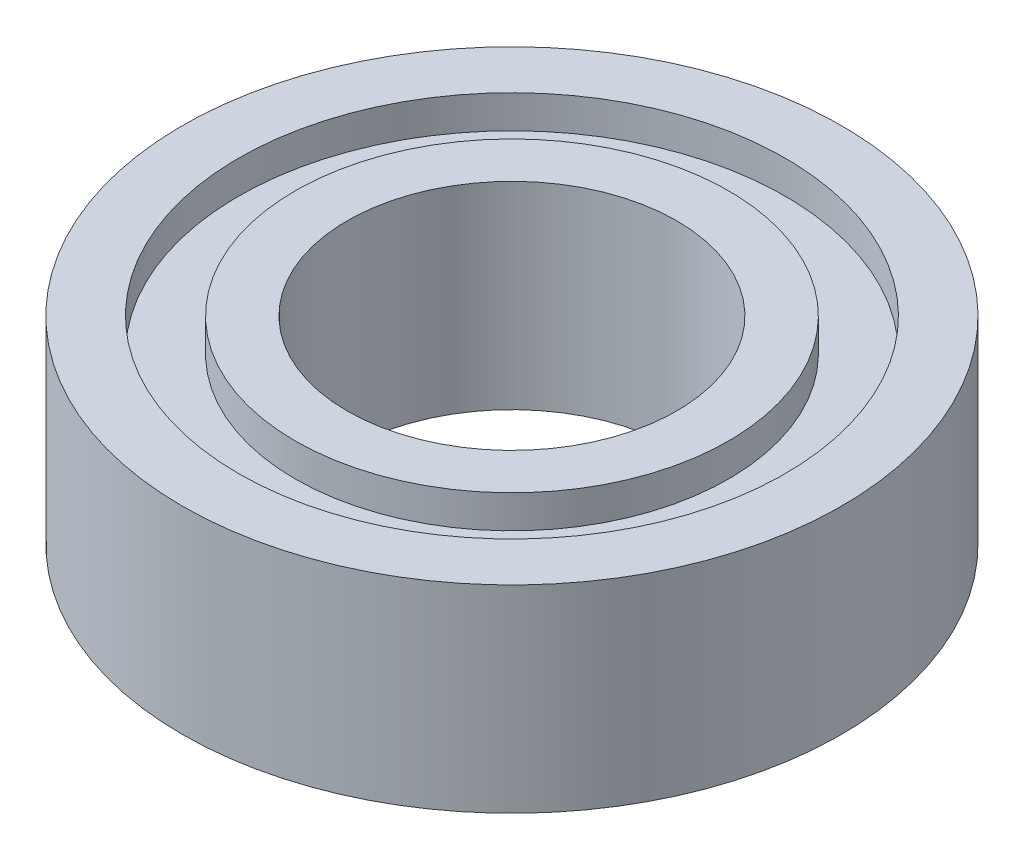
ISO-10303-21;
HEADER;
FILE_DESCRIPTION(('STEP AP214'),'2;1');
FILE_NAME('part.step','',(''),(''),'','','');
FILE_SCHEMA(('AUTOMOTIVE_DESIGN { 1 0 10303 214 1 1 1 1 }'));
ENDSEC;
DATA;
#1=APPLICATION_CONTEXT('core data for automotive mechanical design processes');
#2=APPLICATION_PROTOCOL_DEFINITION('international standard','automotive_design',2000,#1);
#3=PRODUCT_CONTEXT('',#1,'mechanical');
#4=PRODUCT('Part','Part','',(#3));
#5=PRODUCT_RELATED_PRODUCT_CATEGORY('part','',(#4));
#6=PRODUCT_DEFINITION_FORMATION('','',#4);
#7=PRODUCT_DEFINITION_CONTEXT('part definition',#1,'design');
#8=PRODUCT_DEFINITION('design','',#6,#7);
#9=PRODUCT_DEFINITION_SHAPE('','',#8);
#10=(LENGTH_UNIT() NAMED_UNIT(*) SI_UNIT(.MILLI.,.METRE.));
#11=(NAMED_UNIT(*) PLANE_ANGLE_UNIT() SI_UNIT($,.RADIAN.));
#12=(NAMED_UNIT(*) SI_UNIT($,.STERADIAN.) SOLID_ANGLE_UNIT());
#13=UNCERTAINTY_MEASURE_WITH_UNIT(LENGTH_MEASURE(1.E-05),#10,'distance_accuracy_value','');
#14=(GEOMETRIC_REPRESENTATION_CONTEXT(3) GLOBAL_UNCERTAINTY_ASSIGNED_CONTEXT((#13)) GLOBAL_UNIT_ASSIGNED_CONTEXT((#10,
#11,#12)) REPRESENTATION_CONTEXT('',''));
#15=CARTESIAN_POINT('',(0.,0.,0.));
#16=DIRECTION('',(0.,0.,1.));
#17=DIRECTION('',(1.,0.,0.));
#18=AXIS2_PLACEMENT_3D('',#15,#16,#17);
#19=CARTESIAN_POINT('',(0.,-3.,0.));
#20=DIRECTION('',(0.,1.,0.));
#21=DIRECTION('',(0.,0.,1.));
#22=AXIS2_PLACEMENT_3D('',#19,#20,#21);
#23=PLANE('',#22);
#24=CARTESIAN_POINT('',(0.,-3.,0.));
#25=DIRECTION('',(0.,1.,0.));
#26=DIRECTION('',(0.,0.,1.));
#27=AXIS2_PLACEMENT_3D('',#24,#25,#26);
#28=CIRCLE('',#27,5.);
#29=CARTESIAN_POINT('',(0.,-3.,5.));
#30=VERTEX_POINT('',#29);
#31=EDGE_CURVE('E56',#30,#30,#28,.T.);
#32=ORIENTED_EDGE('',*,*,#31,.T.);
#33=EDGE_LOOP('',(#32));
#34=FACE_BOUND('',#33,.T.);
#35=CARTESIAN_POINT('',(0.,-3.,0.));
#36=DIRECTION('',(0.,1.,0.));
#37=DIRECTION('',(0.,0.,1.));
#38=AXIS2_PLACEMENT_3D('',#35,#36,#37);
#39=CIRCLE('',#38,6.57478935956858);
#40=CARTESIAN_POINT('',(0.,-3.,6.57478935956858));
#41=VERTEX_POINT('',#40);
#42=EDGE_CURVE('E80',#41,#41,#39,.T.);
#43=ORIENTED_EDGE('',*,*,#42,.F.);
#44=EDGE_LOOP('',(#43));
#45=FACE_BOUND('',#44,.T.);
#46=ADVANCED_FACE('F43',(#34,#45),#23,.F.);
#47=CARTESIAN_POINT('',(0.,3.,0.));
#48=DIRECTION('',(0.,1.,0.));
#49=DIRECTION('',(0.,0.,1.));
#50=AXIS2_PLACEMENT_3D('',#47,#48,#49);
#51=PLANE('',#50);
#52=CARTESIAN_POINT('',(0.,3.,0.));
#53=DIRECTION('',(0.,1.,0.));
#54=DIRECTION('',(0.,0.,1.));
#55=AXIS2_PLACEMENT_3D('',#52,#53,#54);
#56=CIRCLE('',#55,5.);
#57=CARTESIAN_POINT('',(0.,3.,5.));
#58=VERTEX_POINT('',#57);
#59=EDGE_CURVE('E54',#58,#58,#56,.T.);
#60=ORIENTED_EDGE('',*,*,#59,.F.);
#61=EDGE_LOOP('',(#60));
#62=FACE_BOUND('',#61,.T.);
#63=CARTESIAN_POINT('',(0.,3.,0.));
#64=DIRECTION('',(0.,1.,0.));
#65=DIRECTION('',(0.,0.,1.));
#66=AXIS2_PLACEMENT_3D('',#63,#64,#65);
#67=CIRCLE('',#66,6.57478935956858);
#68=CARTESIAN_POINT('',(0.,3.,6.57478935956858));
#69=VERTEX_POINT('',#68);
#70=EDGE_CURVE('E68',#69,#69,#67,.T.);
#71=ORIENTED_EDGE('',*,*,#70,.T.);
#72=EDGE_LOOP('',(#71));
#73=FACE_BOUND('',#72,.T.);
#74=ADVANCED_FACE('F96',(#62,#73),#51,.T.);
#75=CARTESIAN_POINT('',(0.,3.,0.));
#76=DIRECTION('',(0.,1.,0.));
#77=DIRECTION('',(0.,0.,1.));
#78=AXIS2_PLACEMENT_3D('',#75,#76,#77);
#79=CIRCLE('',#78,8.29265349782376);
#80=CARTESIAN_POINT('',(0.,3.,8.29265349782376));
#81=VERTEX_POINT('',#80);
#82=EDGE_CURVE('E62',#81,#81,#79,.T.);
#83=ORIENTED_EDGE('',*,*,#82,.F.);
#84=EDGE_LOOP('',(#83));
#85=FACE_BOUND('',#84,.T.);
#86=CARTESIAN_POINT('',(0.,3.,0.));
#87=DIRECTION('',(0.,1.,0.));
#88=DIRECTION('',(0.,0.,1.));
#89=AXIS2_PLACEMENT_3D('',#86,#87,#88);
#90=CIRCLE('',#89,10.);
#91=CARTESIAN_POINT('',(0.,3.,10.));
#92=VERTEX_POINT('',#91);
#93=EDGE_CURVE('E10',#92,#92,#90,.T.);
#94=ORIENTED_EDGE('',*,*,#93,.T.);
#95=EDGE_LOOP('',(#94));
#96=FACE_BOUND('',#95,.T.);
#97=ADVANCED_FACE('F102',(#85,#96),#51,.T.);
#98=CARTESIAN_POINT('',(0.,-3.,0.));
#99=DIRECTION('',(0.,1.,0.));
#100=DIRECTION('',(0.,0.,1.));
#101=AXIS2_PLACEMENT_3D('',#98,#99,#100);
#102=CIRCLE('',#101,8.29265349782376);
#103=CARTESIAN_POINT('',(0.,-3.,8.29265349782376));
#104=VERTEX_POINT('',#103);
#105=EDGE_CURVE('E74',#104,#104,#102,.T.);
#106=ORIENTED_EDGE('',*,*,#105,.T.);
#107=EDGE_LOOP('',(#106));
#108=FACE_BOUND('',#107,.T.);
#109=CARTESIAN_POINT('',(0.,-3.,0.));
#110=DIRECTION('',(0.,1.,0.));
#111=DIRECTION('',(0.,0.,1.));
#112=AXIS2_PLACEMENT_3D('',#109,#110,#111);
#113=CIRCLE('',#112,10.);
#114=CARTESIAN_POINT('',(0.,-3.,10.));
#115=VERTEX_POINT('',#114);
#116=EDGE_CURVE('E47',#115,#115,#113,.T.);
#117=ORIENTED_EDGE('',*,*,#116,.F.);
#118=EDGE_LOOP('',(#117));
#119=FACE_BOUND('',#118,.T.);
#120=ADVANCED_FACE('F98',(#108,#119),#23,.F.);
#121=CARTESIAN_POINT('',(0.,3.,0.));
#122=DIRECTION('',(0.,-1.,0.));
#123=DIRECTION('',(0.,0.,-1.));
#124=AXIS2_PLACEMENT_3D('',#121,#122,#123);
#125=CYLINDRICAL_SURFACE('',#124,10.);
#126=ORIENTED_EDGE('',*,*,#93,.F.);
#127=EDGE_LOOP('',(#126));
#128=FACE_BOUND('',#127,.T.);
#129=ORIENTED_EDGE('',*,*,#116,.T.);
#130=EDGE_LOOP('',(#129));
#131=FACE_BOUND('',#130,.T.);
#132=ADVANCED_FACE('F45',(#128,#131),#125,.T.);
#133=CARTESIAN_POINT('',(0.,3.,0.));
#134=DIRECTION('',(0.,-1.,0.));
#135=DIRECTION('',(0.,0.,-1.));
#136=AXIS2_PLACEMENT_3D('',#133,#134,#135);
#137=CYLINDRICAL_SURFACE('',#136,5.);
#138=ORIENTED_EDGE('',*,*,#59,.T.);
#139=EDGE_LOOP('',(#138));
#140=FACE_BOUND('',#139,.T.);
#141=ORIENTED_EDGE('',*,*,#31,.F.);
#142=EDGE_LOOP('',(#141));
#143=FACE_BOUND('',#142,.T.);
#144=ADVANCED_FACE('F111',(#140,#143),#137,.F.);
#145=CARTESIAN_POINT('',(0.,2.,0.));
#146=DIRECTION('',(0.,1.,0.));
#147=DIRECTION('',(0.,0.,1.));
#148=AXIS2_PLACEMENT_3D('',#145,#146,#147);
#149=CYLINDRICAL_SURFACE('',#148,8.29265349782376);
#150=CARTESIAN_POINT('',(0.,2.,0.));
#151=DIRECTION('',(0.,1.,0.));
#152=DIRECTION('',(0.,0.,1.));
#153=AXIS2_PLACEMENT_3D('',#150,#151,#152);
#154=CIRCLE('',#153,8.29265349782376);
#155=CARTESIAN_POINT('',(0.,2.,8.29265349782376));
#156=VERTEX_POINT('',#155);
#157=EDGE_CURVE('E59',#156,#156,#154,.T.);
#158=ORIENTED_EDGE('',*,*,#157,.F.);
#159=EDGE_LOOP('',(#158));
#160=FACE_BOUND('',#159,.T.);
#161=ORIENTED_EDGE('',*,*,#82,.T.);
#162=EDGE_LOOP('',(#161));
#163=FACE_BOUND('',#162,.T.);
#164=ADVANCED_FACE('F135',(#160,#163),#149,.F.);
#165=CARTESIAN_POINT('',(0.,2.,0.));
#166=DIRECTION('',(0.,1.,0.));
#167=DIRECTION('',(0.,0.,1.));
#168=AXIS2_PLACEMENT_3D('',#165,#166,#167);
#169=PLANE('',#168);
#170=CARTESIAN_POINT('',(0.,2.,0.));
#171=DIRECTION('',(0.,1.,0.));
#172=DIRECTION('',(0.,0.,1.));
#173=AXIS2_PLACEMENT_3D('',#170,#171,#172);
#174=CIRCLE('',#173,6.57478935956858);
#175=CARTESIAN_POINT('',(0.,2.,6.57478935956858));
#176=VERTEX_POINT('',#175);
#177=EDGE_CURVE('E65',#176,#176,#174,.T.);
#178=ORIENTED_EDGE('',*,*,#177,.F.);
#179=EDGE_LOOP('',(#178));
#180=FACE_BOUND('',#179,.T.);
#181=ORIENTED_EDGE('',*,*,#157,.T.);
#182=EDGE_LOOP('',(#181));
#183=FACE_BOUND('',#182,.T.);
#184=ADVANCED_FACE('F131',(#180,#183),#169,.T.);
#185=CARTESIAN_POINT('',(0.,2.,0.));
#186=DIRECTION('',(0.,1.,0.));
#187=DIRECTION('',(0.,0.,1.));
#188=AXIS2_PLACEMENT_3D('',#185,#186,#187);
#189=CYLINDRICAL_SURFACE('',#188,6.57478935956858);
#190=ORIENTED_EDGE('',*,*,#177,.T.);
#191=EDGE_LOOP('',(#190));
#192=FACE_BOUND('',#191,.T.);
#193=ORIENTED_EDGE('',*,*,#70,.F.);
#194=EDGE_LOOP('',(#193));
#195=FACE_BOUND('',#194,.T.);
#196=ADVANCED_FACE('F125',(#192,#195),#189,.T.);
#197=CARTESIAN_POINT('',(0.,-2.,0.));
#198=DIRECTION('',(0.,-1.,0.));
#199=DIRECTION('',(0.,0.,1.));
#200=AXIS2_PLACEMENT_3D('',#197,#198,#199);
#201=PLANE('',#200);
#202=CARTESIAN_POINT('',(0.,-2.,0.));
#203=DIRECTION('',(0.,1.,0.));
#204=DIRECTION('',(0.,0.,1.));
#205=AXIS2_PLACEMENT_3D('',#202,#203,#204);
#206=CIRCLE('',#205,8.29265349782376);
#207=CARTESIAN_POINT('',(0.,-2.,8.29265349782376));
#208=VERTEX_POINT('',#207);
#209=EDGE_CURVE('E71',#208,#208,#206,.T.);
#210=ORIENTED_EDGE('',*,*,#209,.F.);
#211=EDGE_LOOP('',(#210));
#212=FACE_BOUND('',#211,.T.);
#213=CARTESIAN_POINT('',(0.,-2.,0.));
#214=DIRECTION('',(0.,1.,0.));
#215=DIRECTION('',(0.,0.,1.));
#216=AXIS2_PLACEMENT_3D('',#213,#214,#215);
#217=CIRCLE('',#216,6.57478935956858);
#218=CARTESIAN_POINT('',(0.,-2.,6.57478935956858));
#219=VERTEX_POINT('',#218);
#220=EDGE_CURVE('E77',#219,#219,#217,.T.);
#221=ORIENTED_EDGE('',*,*,#220,.T.);
#222=EDGE_LOOP('',(#221));
#223=FACE_BOUND('',#222,.T.);
#224=ADVANCED_FACE('F86',(#212,#223),#201,.T.);
#225=CARTESIAN_POINT('',(0.,-2.,0.));
#226=DIRECTION('',(0.,-1.,0.));
#227=DIRECTION('',(0.,0.,-1.));
#228=AXIS2_PLACEMENT_3D('',#225,#226,#227);
#229=CYLINDRICAL_SURFACE('',#228,8.29265349782376);
#230=ORIENTED_EDGE('',*,*,#209,.T.);
#231=EDGE_LOOP('',(#230));
#232=FACE_BOUND('',#231,.T.);
#233=ORIENTED_EDGE('',*,*,#105,.F.);
#234=EDGE_LOOP('',(#233));
#235=FACE_BOUND('',#234,.T.);
#236=ADVANCED_FACE('F91',(#232,#235),#229,.F.);
#237=CARTESIAN_POINT('',(0.,-2.,0.));
#238=DIRECTION('',(0.,-1.,0.));
#239=DIRECTION('',(0.,0.,-1.));
#240=AXIS2_PLACEMENT_3D('',#237,#238,#239);
#241=CYLINDRICAL_SURFACE('',#240,6.57478935956858);
#242=ORIENTED_EDGE('',*,*,#220,.F.);
#243=EDGE_LOOP('',(#242));
#244=FACE_BOUND('',#243,.T.);
#245=ORIENTED_EDGE('',*,*,#42,.T.);
#246=EDGE_LOOP('',(#245));
#247=FACE_BOUND('',#246,.T.);
#248=ADVANCED_FACE('F88',(#244,#247),#241,.T.);
#249=CLOSED_SHELL('',(#46,#74,#97,#120,#132,#144,#164,#184,#196,#224,#236,#248));
#250=MANIFOLD_SOLID_BREP('B2',#249);
#251=ADVANCED_BREP_SHAPE_REPRESENTATION('',(#18,#250),#14);
#252=SHAPE_DEFINITION_REPRESENTATION(#9,#251);
ENDSEC;
END-ISO-10303-21;
